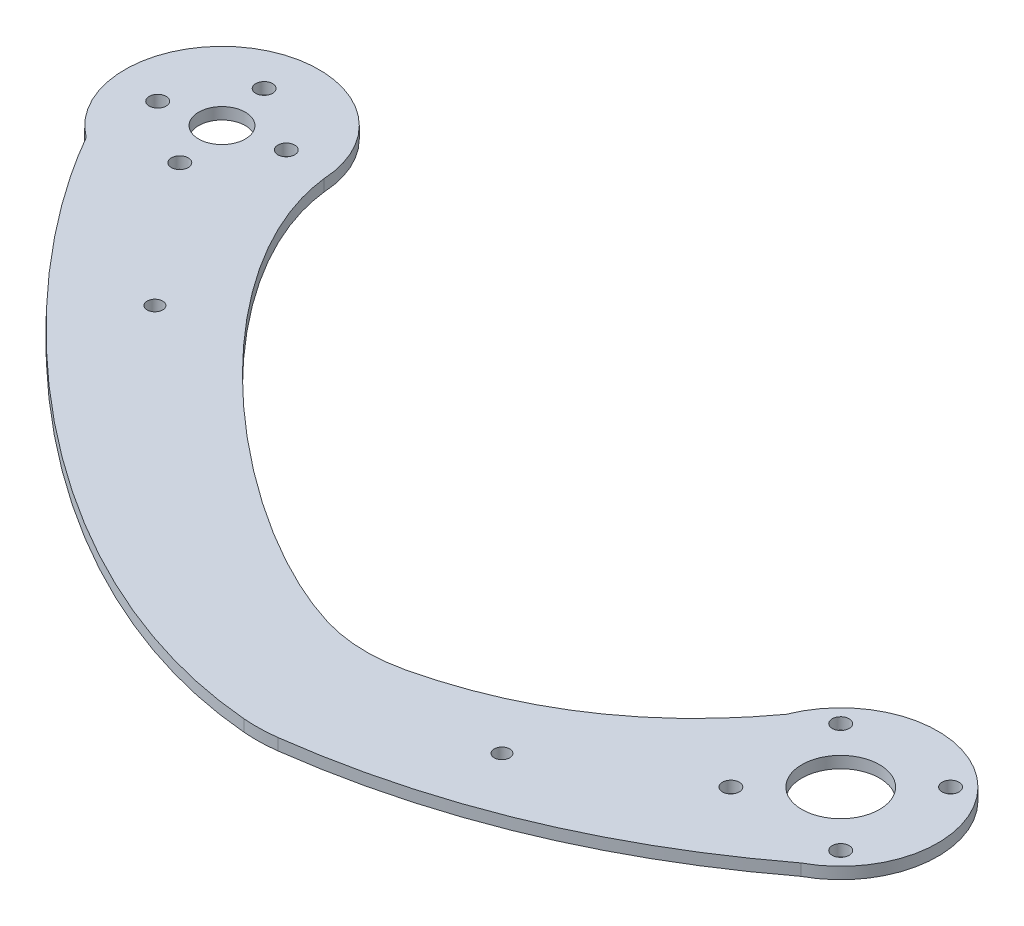
ISO-10303-21;
HEADER;
FILE_DESCRIPTION(('STEP AP214'),'2;1');
FILE_NAME('part.step','',(''),(''),'','','');
FILE_SCHEMA(('AUTOMOTIVE_DESIGN { 1 0 10303 214 1 1 1 1 }'));
ENDSEC;
DATA;
#1=APPLICATION_CONTEXT('core data for automotive mechanical design processes');
#2=APPLICATION_PROTOCOL_DEFINITION('international standard','automotive_design',2000,#1);
#3=PRODUCT_CONTEXT('',#1,'mechanical');
#4=PRODUCT('Part','Part','',(#3));
#5=PRODUCT_RELATED_PRODUCT_CATEGORY('part','',(#4));
#6=PRODUCT_DEFINITION_FORMATION('','',#4);
#7=PRODUCT_DEFINITION_CONTEXT('part definition',#1,'design');
#8=PRODUCT_DEFINITION('design','',#6,#7);
#9=PRODUCT_DEFINITION_SHAPE('','',#8);
#10=(LENGTH_UNIT() NAMED_UNIT(*) SI_UNIT(.MILLI.,.METRE.));
#11=(NAMED_UNIT(*) PLANE_ANGLE_UNIT() SI_UNIT($,.RADIAN.));
#12=(NAMED_UNIT(*) SI_UNIT($,.STERADIAN.) SOLID_ANGLE_UNIT());
#13=UNCERTAINTY_MEASURE_WITH_UNIT(LENGTH_MEASURE(1.E-05),#10,'distance_accuracy_value','');
#14=(GEOMETRIC_REPRESENTATION_CONTEXT(3) GLOBAL_UNCERTAINTY_ASSIGNED_CONTEXT((#13)) GLOBAL_UNIT_ASSIGNED_CONTEXT((#10,
#11,#12)) REPRESENTATION_CONTEXT('',''));
#15=CARTESIAN_POINT('',(0.,0.,0.));
#16=DIRECTION('',(0.,0.,1.));
#17=DIRECTION('',(1.,0.,0.));
#18=AXIS2_PLACEMENT_3D('',#15,#16,#17);
#19=CARTESIAN_POINT('',(-43.7150317978709,1.5,30.941916125743));
#20=CARTESIAN_POINT('',(-74.6558875999215,1.5,29.7721762631503));
#21=CARTESIAN_POINT('',(-107.934743733726,1.5,-0.909272839135125));
#22=CARTESIAN_POINT('',(-120.988196927905,1.5,-23.8545655711311));
#23=B_SPLINE_CURVE_WITH_KNOTS('',3,(#19,#20,#21,#22),.UNSPECIFIED.,.F.,.F.,(4,4),(0.,1.),.UNSPECIFIED.);
#24=DIRECTION('',(0.,-1.,0.));
#25=VECTOR('',#24,1.);
#26=SURFACE_OF_LINEAR_EXTRUSION('',#23,#25);
#27=CARTESIAN_POINT('',(-43.7150317978709,0.,30.941916125743));
#28=CARTESIAN_POINT('',(-74.6558875999215,0.,29.7721762631503));
#29=CARTESIAN_POINT('',(-107.934743733726,0.,-0.909272839135125));
#30=CARTESIAN_POINT('',(-120.988196927905,0.,-23.8545655711311));
#31=B_SPLINE_CURVE_WITH_KNOTS('',3,(#27,#28,#29,#30),.UNSPECIFIED.,.F.,.F.,(4,4),(0.,1.),.UNSPECIFIED.);
#32=CARTESIAN_POINT('',(-46.0345753609874,0.,30.7998596208397));
#33=VERTEX_POINT('',#32);
#34=CARTESIAN_POINT('',(-120.988196927905,0.,-23.8545655711311));
#35=VERTEX_POINT('',#34);
#36=EDGE_CURVE('E185',#33,#35,#31,.T.);
#37=ORIENTED_EDGE('',*,*,#36,.F.);
#38=DIRECTION('',(0.,-1.,0.));
#39=VECTOR('',#38,1.);
#40=CARTESIAN_POINT('',(-46.0345753609874,0.,30.7998596208398));
#41=LINE('',#40,#39);
#42=CARTESIAN_POINT('',(-46.0345753609874,1.5,30.7998596208397));
#43=VERTEX_POINT('',#42);
#44=EDGE_CURVE('E52',#33,#43,#41,.F.);
#45=ORIENTED_EDGE('',*,*,#44,.T.);
#46=CARTESIAN_POINT('',(-120.988196927905,1.5,-23.8545655711311));
#47=VERTEX_POINT('',#46);
#48=EDGE_CURVE('E133',#43,#47,#23,.T.);
#49=ORIENTED_EDGE('',*,*,#48,.T.);
#50=DIRECTION('',(0.,-1.,0.));
#51=VECTOR('',#50,1.);
#52=CARTESIAN_POINT('',(-120.988196927905,1.5,-23.8545655711311));
#53=LINE('',#52,#51);
#54=EDGE_CURVE('E290',#47,#35,#53,.T.);
#55=ORIENTED_EDGE('',*,*,#54,.T.);
#56=EDGE_LOOP('',(#37,#45,#49,#55));
#57=FACE_BOUND('',#56,.T.);
#58=ADVANCED_FACE('F43',(#57),#26,.T.);
#59=CARTESIAN_POINT('',(5.89271121734806,1.5,11.0238811000908));
#60=CARTESIAN_POINT('',(-16.2082829222259,1.5,27.8197472460681));
#61=CARTESIAN_POINT('',(-43.7150317978709,1.5,30.941916125743));
#62=B_SPLINE_CURVE_WITH_KNOTS('',2,(#59,#60,#61),.UNSPECIFIED.,.F.,.F.,(3,3),(0.,1.),.UNSPECIFIED.);
#63=DIRECTION('',(0.,-1.,0.));
#64=VECTOR('',#63,1.);
#65=SURFACE_OF_LINEAR_EXTRUSION('',#62,#64);
#66=CARTESIAN_POINT('',(5.89271121734806,1.5,11.0238811000908));
#67=VERTEX_POINT('',#66);
#68=CARTESIAN_POINT('',(-41.726584062277,1.5,30.6974169888949));
#69=VERTEX_POINT('',#68);
#70=EDGE_CURVE('E113',#67,#69,#62,.T.);
#71=ORIENTED_EDGE('',*,*,#70,.T.);
#72=DIRECTION('',(0.,-1.,0.));
#73=VECTOR('',#72,1.);
#74=CARTESIAN_POINT('',(-41.726584062277,1.5,30.6974169888949));
#75=LINE('',#74,#73);
#76=CARTESIAN_POINT('',(-41.726584062277,0.,30.6974169888949));
#77=VERTEX_POINT('',#76);
#78=EDGE_CURVE('E173',#69,#77,#75,.T.);
#79=ORIENTED_EDGE('',*,*,#78,.T.);
#80=CARTESIAN_POINT('',(5.89271121734806,0.,11.0238811000908));
#81=CARTESIAN_POINT('',(-16.2082829222259,0.,27.8197472460681));
#82=CARTESIAN_POINT('',(-43.7150317978709,0.,30.941916125743));
#83=B_SPLINE_CURVE_WITH_KNOTS('',2,(#80,#81,#82),.UNSPECIFIED.,.F.,.F.,(3,3),(0.,1.),.UNSPECIFIED.);
#84=CARTESIAN_POINT('',(5.89271121734806,0.,11.0238811000908));
#85=VERTEX_POINT('',#84);
#86=EDGE_CURVE('E115',#85,#77,#83,.T.);
#87=ORIENTED_EDGE('',*,*,#86,.F.);
#88=DIRECTION('',(0.,-1.,0.));
#89=VECTOR('',#88,1.);
#90=CARTESIAN_POINT('',(5.89271121734806,1.5,11.0238811000908));
#91=LINE('',#90,#89);
#92=EDGE_CURVE('E108',#67,#85,#91,.T.);
#93=ORIENTED_EDGE('',*,*,#92,.F.);
#94=EDGE_LOOP('',(#71,#79,#87,#93));
#95=FACE_BOUND('',#94,.T.);
#96=ADVANCED_FACE('F110',(#95),#65,.T.);
#97=CARTESIAN_POINT('',(0.,1.5,0.));
#98=DIRECTION('',(0.,-1.,0.));
#99=DIRECTION('',(0.,0.,-1.));
#100=AXIS2_PLACEMENT_3D('',#97,#98,#99);
#101=CYLINDRICAL_SURFACE('',#100,12.5);
#102=CARTESIAN_POINT('',(0.,0.,0.));
#103=DIRECTION('',(0.,1.,0.));
#104=DIRECTION('',(0.,0.,1.));
#105=AXIS2_PLACEMENT_3D('',#102,#103,#104);
#106=CIRCLE('',#105,12.5);
#107=CARTESIAN_POINT('',(-11.6175816478134,0.,-4.61321977109145));
#108=VERTEX_POINT('',#107);
#109=EDGE_CURVE('E300',#85,#108,#106,.T.);
#110=ORIENTED_EDGE('',*,*,#109,.T.);
#111=DIRECTION('',(0.,-1.,0.));
#112=VECTOR('',#111,1.);
#113=CARTESIAN_POINT('',(-11.6175816478134,1.5,-4.61321977109145));
#114=LINE('',#113,#112);
#115=CARTESIAN_POINT('',(-11.6175816478134,1.5,-4.61321977109145));
#116=VERTEX_POINT('',#115);
#117=EDGE_CURVE('E120',#116,#108,#114,.T.);
#118=ORIENTED_EDGE('',*,*,#117,.F.);
#119=CARTESIAN_POINT('',(0.,1.5,0.));
#120=DIRECTION('',(0.,1.,0.));
#121=DIRECTION('',(0.,0.,1.));
#122=AXIS2_PLACEMENT_3D('',#119,#120,#121);
#123=CIRCLE('',#122,12.5);
#124=EDGE_CURVE('E124',#67,#116,#123,.T.);
#125=ORIENTED_EDGE('',*,*,#124,.F.);
#126=ORIENTED_EDGE('',*,*,#92,.T.);
#127=EDGE_LOOP('',(#110,#118,#125,#126));
#128=FACE_BOUND('',#127,.T.);
#129=ADVANCED_FACE('F125',(#128),#101,.T.);
#130=CARTESIAN_POINT('',(-44.5148949759072,1.5,15.6481190292885));
#131=CARTESIAN_POINT('',(-23.7549924871948,1.5,12.0499323994041));
#132=CARTESIAN_POINT('',(-11.6175816478134,1.5,-4.61321977109147));
#133=B_SPLINE_CURVE_WITH_KNOTS('',2,(#130,#131,#132),.UNSPECIFIED.,.F.,.F.,(3,3),(0.,1.),.UNSPECIFIED.);
#134=DIRECTION('',(0.,-1.,0.));
#135=VECTOR('',#134,1.);
#136=SURFACE_OF_LINEAR_EXTRUSION('',#133,#135);
#137=CARTESIAN_POINT('',(-44.5148949759072,0.,15.6481190292885));
#138=CARTESIAN_POINT('',(-23.7549924871948,0.,12.0499323994041));
#139=CARTESIAN_POINT('',(-11.6175816478134,0.,-4.61321977109147));
#140=B_SPLINE_CURVE_WITH_KNOTS('',2,(#137,#138,#139),.UNSPECIFIED.,.F.,.F.,(3,3),(0.,1.),.UNSPECIFIED.);
#141=CARTESIAN_POINT('',(-41.0573845146919,0.,14.9442364399678));
#142=VERTEX_POINT('',#141);
#143=EDGE_CURVE('E305',#142,#108,#140,.T.);
#144=ORIENTED_EDGE('',*,*,#143,.F.);
#145=DIRECTION('',(0.,-1.,0.));
#146=VECTOR('',#145,1.);
#147=CARTESIAN_POINT('',(-41.0573845146919,0.,14.9442364399678));
#148=LINE('',#147,#146);
#149=CARTESIAN_POINT('',(-41.0573845146919,1.5,14.9442364399678));
#150=VERTEX_POINT('',#149);
#151=EDGE_CURVE('E170',#142,#150,#148,.F.);
#152=ORIENTED_EDGE('',*,*,#151,.T.);
#153=EDGE_CURVE('E129',#150,#116,#133,.T.);
#154=ORIENTED_EDGE('',*,*,#153,.T.);
#155=ORIENTED_EDGE('',*,*,#117,.T.);
#156=EDGE_LOOP('',(#144,#152,#154,#155));
#157=FACE_BOUND('',#156,.T.);
#158=ADVANCED_FACE('F274',(#157),#136,.T.);
#159=CARTESIAN_POINT('',(-44.5148949759072,1.5,15.6481190292885));
#160=CARTESIAN_POINT('',(-60.4932461919799,1.5,16.6209660956188));
#161=CARTESIAN_POINT('',(-98.7193744847428,1.5,-13.9940161599674));
#162=CARTESIAN_POINT('',(-101.09932332728,1.5,-34.5772843276964));
#163=B_SPLINE_CURVE_WITH_KNOTS('',3,(#159,#160,#161,#162),.UNSPECIFIED.,.F.,.F.,(4,4),(0.,1.),.UNSPECIFIED.);
#164=DIRECTION('',(0.,-1.,0.));
#165=VECTOR('',#164,1.);
#166=SURFACE_OF_LINEAR_EXTRUSION('',#163,#165);
#167=CARTESIAN_POINT('',(-51.4707376675789,1.5,14.6030158370746));
#168=VERTEX_POINT('',#167);
#169=CARTESIAN_POINT('',(-101.09932332728,1.5,-34.5772843276964));
#170=VERTEX_POINT('',#169);
#171=EDGE_CURVE('E276',#168,#170,#163,.T.);
#172=ORIENTED_EDGE('',*,*,#171,.F.);
#173=DIRECTION('',(0.,-1.,0.));
#174=VECTOR('',#173,1.);
#175=CARTESIAN_POINT('',(-51.4707376675789,1.5,14.6030158370746));
#176=LINE('',#175,#174);
#177=CARTESIAN_POINT('',(-51.4707376675789,0.,14.6030158370746));
#178=VERTEX_POINT('',#177);
#179=EDGE_CURVE('E119',#168,#178,#176,.T.);
#180=ORIENTED_EDGE('',*,*,#179,.T.);
#181=CARTESIAN_POINT('',(-44.5148949759072,0.,15.6481190292885));
#182=CARTESIAN_POINT('',(-60.4932461919799,0.,16.6209660956188));
#183=CARTESIAN_POINT('',(-98.7193744847428,0.,-13.9940161599674));
#184=CARTESIAN_POINT('',(-101.09932332728,0.,-34.5772843276964));
#185=B_SPLINE_CURVE_WITH_KNOTS('',3,(#181,#182,#183,#184),.UNSPECIFIED.,.F.,.F.,(4,4),(0.,1.),.UNSPECIFIED.);
#186=CARTESIAN_POINT('',(-101.09932332728,0.,-34.5772843276964));
#187=VERTEX_POINT('',#186);
#188=EDGE_CURVE('E309',#178,#187,#185,.T.);
#189=ORIENTED_EDGE('',*,*,#188,.T.);
#190=DIRECTION('',(0.,-1.,0.));
#191=VECTOR('',#190,1.);
#192=CARTESIAN_POINT('',(-101.09932332728,1.5,-34.5772843276964));
#193=LINE('',#192,#191);
#194=EDGE_CURVE('E323',#170,#187,#193,.T.);
#195=ORIENTED_EDGE('',*,*,#194,.F.);
#196=EDGE_LOOP('',(#172,#180,#189,#195));
#197=FACE_BOUND('',#196,.T.);
#198=ADVANCED_FACE('F264',(#197),#166,.F.);
#199=CARTESIAN_POINT('',(-113.582262858622,1.5,-33.92442855736));
#200=DIRECTION('',(0.,-1.,0.));
#201=DIRECTION('',(0.,0.,-1.));
#202=AXIS2_PLACEMENT_3D('',#199,#200,#201);
#203=CYLINDRICAL_SURFACE('',#202,12.5);
#204=CARTESIAN_POINT('',(-113.582262858622,0.,-33.92442855736));
#205=DIRECTION('',(0.,1.,0.));
#206=DIRECTION('',(0.,0.,1.));
#207=AXIS2_PLACEMENT_3D('',#204,#205,#206);
#208=CIRCLE('',#207,12.5);
#209=EDGE_CURVE('E135',#187,#35,#208,.T.);
#210=ORIENTED_EDGE('',*,*,#209,.T.);
#211=ORIENTED_EDGE('',*,*,#54,.F.);
#212=CARTESIAN_POINT('',(-113.582262858622,1.5,-33.92442855736));
#213=DIRECTION('',(0.,1.,0.));
#214=DIRECTION('',(0.,0.,1.));
#215=AXIS2_PLACEMENT_3D('',#212,#213,#214);
#216=CIRCLE('',#215,12.5);
#217=EDGE_CURVE('E281',#170,#47,#216,.T.);
#218=ORIENTED_EDGE('',*,*,#217,.F.);
#219=ORIENTED_EDGE('',*,*,#194,.T.);
#220=EDGE_LOOP('',(#210,#211,#218,#219));
#221=FACE_BOUND('',#220,.T.);
#222=ADVANCED_FACE('F258',(#221),#203,.T.);
#223=CARTESIAN_POINT('',(0.,1.5,0.));
#224=DIRECTION('',(0.,1.,0.));
#225=DIRECTION('',(0.,0.,1.));
#226=AXIS2_PLACEMENT_3D('',#223,#224,#225);
#227=PLANE('',#226);
#228=CARTESIAN_POINT('',(-25.5617243230472,1.5,18.0513040104756));
#229=DIRECTION('',(0.,1.,0.));
#230=DIRECTION('',(0.,0.,1.));
#231=AXIS2_PLACEMENT_3D('',#228,#229,#230);
#232=CIRCLE('',#231,1.);
#233=CARTESIAN_POINT('',(-25.5617243230472,1.5,19.0513040104756));
#234=VERTEX_POINT('',#233);
#235=EDGE_CURVE('E234',#234,#234,#232,.T.);
#236=ORIENTED_EDGE('',*,*,#235,.F.);
#237=EDGE_LOOP('',(#236));
#238=FACE_BOUND('',#237,.T.);
#239=CARTESIAN_POINT('',(-97.8402350611844,1.5,-9.54296842905933));
#240=DIRECTION('',(0.,1.,0.));
#241=DIRECTION('',(0.,0.,1.));
#242=AXIS2_PLACEMENT_3D('',#239,#240,#241);
#243=CIRCLE('',#242,0.999999999999998);
#244=CARTESIAN_POINT('',(-97.8402350611844,1.5,-8.54296842905933));
#245=VERTEX_POINT('',#244);
#246=EDGE_CURVE('E224',#245,#245,#243,.T.);
#247=ORIENTED_EDGE('',*,*,#246,.F.);
#248=EDGE_LOOP('',(#247));
#249=FACE_BOUND('',#248,.T.);
#250=CARTESIAN_POINT('',(-120.435814162868,1.5,-32.5000569344801));
#251=DIRECTION('',(0.,1.,0.));
#252=DIRECTION('',(0.,0.,1.));
#253=AXIS2_PLACEMENT_3D('',#250,#251,#252);
#254=CIRCLE('',#253,1.08999999999999);
#255=CARTESIAN_POINT('',(-120.435814162868,1.5,-31.4100569344801));
#256=VERTEX_POINT('',#255);
#257=EDGE_CURVE('E221',#256,#256,#254,.T.);
#258=ORIENTED_EDGE('',*,*,#257,.F.);
#259=EDGE_LOOP('',(#258));
#260=FACE_BOUND('',#259,.T.);
#261=CARTESIAN_POINT('',(-112.157891235742,1.5,-27.0708772531138));
#262=DIRECTION('',(0.,1.,0.));
#263=DIRECTION('',(0.,0.,1.));
#264=AXIS2_PLACEMENT_3D('',#261,#262,#263);
#265=CIRCLE('',#264,1.09);
#266=CARTESIAN_POINT('',(-112.157891235742,1.5,-25.9808772531138));
#267=VERTEX_POINT('',#266);
#268=EDGE_CURVE('E218',#267,#267,#265,.T.);
#269=ORIENTED_EDGE('',*,*,#268,.F.);
#270=EDGE_LOOP('',(#269));
#271=FACE_BOUND('',#270,.T.);
#272=CARTESIAN_POINT('',(-115.006634481501,1.5,-40.7779798616062));
#273=DIRECTION('',(0.,1.,0.));
#274=DIRECTION('',(0.,0.,1.));
#275=AXIS2_PLACEMENT_3D('',#272,#273,#274);
#276=CIRCLE('',#275,1.09000000000004);
#277=CARTESIAN_POINT('',(-115.006634481501,1.5,-39.6879798616061));
#278=VERTEX_POINT('',#277);
#279=EDGE_CURVE('E214',#278,#278,#276,.T.);
#280=ORIENTED_EDGE('',*,*,#279,.F.);
#281=EDGE_LOOP('',(#280));
#282=FACE_BOUND('',#281,.T.);
#283=CARTESIAN_POINT('',(-106.728711554375,1.5,-35.3488001802398));
#284=DIRECTION('',(0.,1.,0.));
#285=DIRECTION('',(0.,0.,1.));
#286=AXIS2_PLACEMENT_3D('',#283,#284,#285);
#287=CIRCLE('',#286,1.08999999999999);
#288=CARTESIAN_POINT('',(-106.728711554375,1.5,-34.2588001802398));
#289=VERTEX_POINT('',#288);
#290=EDGE_CURVE('E210',#289,#289,#287,.T.);
#291=ORIENTED_EDGE('',*,*,#290,.F.);
#292=EDGE_LOOP('',(#291));
#293=FACE_BOUND('',#292,.T.);
#294=CARTESIAN_POINT('',(-7.07106781186559,1.5,7.07106781186536));
#295=DIRECTION('',(0.,1.,0.));
#296=DIRECTION('',(0.,0.,1.));
#297=AXIS2_PLACEMENT_3D('',#294,#295,#296);
#298=CIRCLE('',#297,1.09);
#299=CARTESIAN_POINT('',(-7.07106781186559,1.5,8.16106781186536));
#300=VERTEX_POINT('',#299);
#301=EDGE_CURVE('E206',#300,#300,#298,.T.);
#302=ORIENTED_EDGE('',*,*,#301,.F.);
#303=EDGE_LOOP('',(#302));
#304=FACE_BOUND('',#303,.T.);
#305=CARTESIAN_POINT('',(7.07106781186539,1.5,7.07106781186556));
#306=DIRECTION('',(0.,1.,0.));
#307=DIRECTION('',(0.,0.,1.));
#308=AXIS2_PLACEMENT_3D('',#305,#306,#307);
#309=CIRCLE('',#308,1.09);
#310=CARTESIAN_POINT('',(7.07106781186539,1.5,8.16106781186556));
#311=VERTEX_POINT('',#310);
#312=EDGE_CURVE('E202',#311,#311,#309,.T.);
#313=ORIENTED_EDGE('',*,*,#312,.F.);
#314=EDGE_LOOP('',(#313));
#315=FACE_BOUND('',#314,.T.);
#316=CARTESIAN_POINT('',(7.07106781186554,1.5,-7.07106781186541));
#317=DIRECTION('',(0.,1.,0.));
#318=DIRECTION('',(0.,0.,1.));
#319=AXIS2_PLACEMENT_3D('',#316,#317,#318);
#320=CIRCLE('',#319,1.09);
#321=CARTESIAN_POINT('',(7.07106781186554,1.5,-5.98106781186541));
#322=VERTEX_POINT('',#321);
#323=EDGE_CURVE('E198',#322,#322,#320,.T.);
#324=ORIENTED_EDGE('',*,*,#323,.F.);
#325=EDGE_LOOP('',(#324));
#326=FACE_BOUND('',#325,.T.);
#327=CARTESIAN_POINT('',(-113.582262858622,1.5,-33.92442855736));
#328=DIRECTION('',(0.,1.,0.));
#329=DIRECTION('',(0.,0.,1.));
#330=AXIS2_PLACEMENT_3D('',#327,#328,#329);
#331=CIRCLE('',#330,3.00000000000001);
#332=CARTESIAN_POINT('',(-113.582262858622,1.5,-30.9244285573599));
#333=VERTEX_POINT('',#332);
#334=EDGE_CURVE('E194',#333,#333,#331,.T.);
#335=ORIENTED_EDGE('',*,*,#334,.F.);
#336=EDGE_LOOP('',(#335));
#337=FACE_BOUND('',#336,.T.);
#338=CARTESIAN_POINT('',(-7.07106781186544,1.5,-7.07106781186551));
#339=DIRECTION('',(0.,1.,0.));
#340=DIRECTION('',(0.,0.,1.));
#341=AXIS2_PLACEMENT_3D('',#338,#339,#340);
#342=CIRCLE('',#341,1.09);
#343=CARTESIAN_POINT('',(-7.07106781186544,1.5,-5.98106781186551));
#344=VERTEX_POINT('',#343);
#345=EDGE_CURVE('E190',#344,#344,#342,.T.);
#346=ORIENTED_EDGE('',*,*,#345,.F.);
#347=EDGE_LOOP('',(#346));
#348=FACE_BOUND('',#347,.T.);
#349=CARTESIAN_POINT('',(0.,1.5,0.));
#350=DIRECTION('',(0.,1.,0.));
#351=DIRECTION('',(0.,0.,1.));
#352=AXIS2_PLACEMENT_3D('',#349,#350,#351);
#353=CIRCLE('',#352,5.);
#354=CARTESIAN_POINT('',(0.,1.5,5.));
#355=VERTEX_POINT('',#354);
#356=EDGE_CURVE('E186',#355,#355,#353,.T.);
#357=ORIENTED_EDGE('',*,*,#356,.F.);
#358=EDGE_LOOP('',(#357));
#359=FACE_BOUND('',#358,.T.);
#360=ORIENTED_EDGE('',*,*,#48,.F.);
#361=CARTESIAN_POINT('',(-44.3532717021132,1.5,10.8706544684345));
#362=DIRECTION('',(0.,1.,0.));
#363=DIRECTION('',(0.,0.,1.));
#364=AXIS2_PLACEMENT_3D('',#361,#362,#363);
#365=CIRCLE('',#364,20.);
#366=EDGE_CURVE('E11',#43,#69,#365,.T.);
#367=ORIENTED_EDGE('',*,*,#366,.T.);
#368=ORIENTED_EDGE('',*,*,#70,.F.);
#369=ORIENTED_EDGE('',*,*,#124,.T.);
#370=ORIENTED_EDGE('',*,*,#153,.F.);
#371=CARTESIAN_POINT('',(-45.6316705884273,1.5,-4.52563533453622));
#372=DIRECTION('',(0.,1.,0.));
#373=DIRECTION('',(0.,0.,1.));
#374=AXIS2_PLACEMENT_3D('',#371,#372,#373);
#375=CIRCLE('',#374,20.);
#376=EDGE_CURVE('E169',#150,#168,#375,.F.);
#377=ORIENTED_EDGE('',*,*,#376,.T.);
#378=ORIENTED_EDGE('',*,*,#171,.T.);
#379=ORIENTED_EDGE('',*,*,#217,.T.);
#380=EDGE_LOOP('',(#360,#367,#368,#369,#370,#377,#378,#379));
#381=FACE_BOUND('',#380,.T.);
#382=ADVANCED_FACE('F131',(#238,#249,#260,#271,#282,#293,#304,#315,#326,#337,#348,#359,#381),
#227,.T.);
#383=CARTESIAN_POINT('',(0.,0.,0.));
#384=DIRECTION('',(0.,1.,0.));
#385=DIRECTION('',(0.,0.,1.));
#386=AXIS2_PLACEMENT_3D('',#383,#384,#385);
#387=PLANE('',#386);
#388=CARTESIAN_POINT('',(-25.5617243230472,0.,18.0513040104756));
#389=DIRECTION('',(0.,1.,0.));
#390=DIRECTION('',(0.,0.,1.));
#391=AXIS2_PLACEMENT_3D('',#388,#389,#390);
#392=CIRCLE('',#391,1.);
#393=CARTESIAN_POINT('',(-25.5617243230472,0.,19.0513040104756));
#394=VERTEX_POINT('',#393);
#395=EDGE_CURVE('E47',#394,#394,#392,.T.);
#396=ORIENTED_EDGE('',*,*,#395,.T.);
#397=EDGE_LOOP('',(#396));
#398=FACE_BOUND('',#397,.T.);
#399=CARTESIAN_POINT('',(-97.8402350611844,0.,-9.54296842905933));
#400=DIRECTION('',(0.,1.,0.));
#401=DIRECTION('',(0.,0.,1.));
#402=AXIS2_PLACEMENT_3D('',#399,#400,#401);
#403=CIRCLE('',#402,0.999999999999998);
#404=CARTESIAN_POINT('',(-97.8402350611844,0.,-8.54296842905933));
#405=VERTEX_POINT('',#404);
#406=EDGE_CURVE('E222',#405,#405,#403,.T.);
#407=ORIENTED_EDGE('',*,*,#406,.T.);
#408=EDGE_LOOP('',(#407));
#409=FACE_BOUND('',#408,.T.);
#410=CARTESIAN_POINT('',(-120.435814162868,0.,-32.5000569344801));
#411=DIRECTION('',(0.,1.,0.));
#412=DIRECTION('',(0.,0.,1.));
#413=AXIS2_PLACEMENT_3D('',#410,#411,#412);
#414=CIRCLE('',#413,1.08999999999999);
#415=CARTESIAN_POINT('',(-120.435814162868,0.,-31.4100569344801));
#416=VERTEX_POINT('',#415);
#417=EDGE_CURVE('E219',#416,#416,#414,.T.);
#418=ORIENTED_EDGE('',*,*,#417,.T.);
#419=EDGE_LOOP('',(#418));
#420=FACE_BOUND('',#419,.T.);
#421=CARTESIAN_POINT('',(-112.157891235742,0.,-27.0708772531138));
#422=DIRECTION('',(0.,1.,0.));
#423=DIRECTION('',(0.,0.,1.));
#424=AXIS2_PLACEMENT_3D('',#421,#422,#423);
#425=CIRCLE('',#424,1.09);
#426=CARTESIAN_POINT('',(-112.157891235742,0.,-25.9808772531138));
#427=VERTEX_POINT('',#426);
#428=EDGE_CURVE('E215',#427,#427,#425,.T.);
#429=ORIENTED_EDGE('',*,*,#428,.T.);
#430=EDGE_LOOP('',(#429));
#431=FACE_BOUND('',#430,.T.);
#432=CARTESIAN_POINT('',(-115.006634481501,0.,-40.7779798616062));
#433=DIRECTION('',(0.,1.,0.));
#434=DIRECTION('',(0.,0.,1.));
#435=AXIS2_PLACEMENT_3D('',#432,#433,#434);
#436=CIRCLE('',#435,1.09000000000004);
#437=CARTESIAN_POINT('',(-115.006634481501,0.,-39.6879798616061));
#438=VERTEX_POINT('',#437);
#439=EDGE_CURVE('E211',#438,#438,#436,.T.);
#440=ORIENTED_EDGE('',*,*,#439,.T.);
#441=EDGE_LOOP('',(#440));
#442=FACE_BOUND('',#441,.T.);
#443=CARTESIAN_POINT('',(-106.728711554375,0.,-35.3488001802398));
#444=DIRECTION('',(0.,1.,0.));
#445=DIRECTION('',(0.,0.,1.));
#446=AXIS2_PLACEMENT_3D('',#443,#444,#445);
#447=CIRCLE('',#446,1.08999999999999);
#448=CARTESIAN_POINT('',(-106.728711554375,0.,-34.2588001802398));
#449=VERTEX_POINT('',#448);
#450=EDGE_CURVE('E207',#449,#449,#447,.T.);
#451=ORIENTED_EDGE('',*,*,#450,.T.);
#452=EDGE_LOOP('',(#451));
#453=FACE_BOUND('',#452,.T.);
#454=CARTESIAN_POINT('',(-7.07106781186559,0.,7.07106781186536));
#455=DIRECTION('',(0.,1.,0.));
#456=DIRECTION('',(0.,0.,1.));
#457=AXIS2_PLACEMENT_3D('',#454,#455,#456);
#458=CIRCLE('',#457,1.09);
#459=CARTESIAN_POINT('',(-7.07106781186559,0.,8.16106781186536));
#460=VERTEX_POINT('',#459);
#461=EDGE_CURVE('E203',#460,#460,#458,.T.);
#462=ORIENTED_EDGE('',*,*,#461,.T.);
#463=EDGE_LOOP('',(#462));
#464=FACE_BOUND('',#463,.T.);
#465=CARTESIAN_POINT('',(7.07106781186539,0.,7.07106781186556));
#466=DIRECTION('',(0.,1.,0.));
#467=DIRECTION('',(0.,0.,1.));
#468=AXIS2_PLACEMENT_3D('',#465,#466,#467);
#469=CIRCLE('',#468,1.09);
#470=CARTESIAN_POINT('',(7.07106781186539,0.,8.16106781186556));
#471=VERTEX_POINT('',#470);
#472=EDGE_CURVE('E199',#471,#471,#469,.T.);
#473=ORIENTED_EDGE('',*,*,#472,.T.);
#474=EDGE_LOOP('',(#473));
#475=FACE_BOUND('',#474,.T.);
#476=CARTESIAN_POINT('',(7.07106781186554,0.,-7.07106781186541));
#477=DIRECTION('',(0.,1.,0.));
#478=DIRECTION('',(0.,0.,1.));
#479=AXIS2_PLACEMENT_3D('',#476,#477,#478);
#480=CIRCLE('',#479,1.09);
#481=CARTESIAN_POINT('',(7.07106781186554,0.,-5.98106781186541));
#482=VERTEX_POINT('',#481);
#483=EDGE_CURVE('E195',#482,#482,#480,.T.);
#484=ORIENTED_EDGE('',*,*,#483,.T.);
#485=EDGE_LOOP('',(#484));
#486=FACE_BOUND('',#485,.T.);
#487=CARTESIAN_POINT('',(-113.582262858622,0.,-33.92442855736));
#488=DIRECTION('',(0.,1.,0.));
#489=DIRECTION('',(0.,0.,1.));
#490=AXIS2_PLACEMENT_3D('',#487,#488,#489);
#491=CIRCLE('',#490,3.00000000000001);
#492=CARTESIAN_POINT('',(-113.582262858622,0.,-30.9244285573599));
#493=VERTEX_POINT('',#492);
#494=EDGE_CURVE('E191',#493,#493,#491,.T.);
#495=ORIENTED_EDGE('',*,*,#494,.T.);
#496=EDGE_LOOP('',(#495));
#497=FACE_BOUND('',#496,.T.);
#498=CARTESIAN_POINT('',(-7.07106781186544,0.,-7.07106781186551));
#499=DIRECTION('',(0.,1.,0.));
#500=DIRECTION('',(0.,0.,1.));
#501=AXIS2_PLACEMENT_3D('',#498,#499,#500);
#502=CIRCLE('',#501,1.09);
#503=CARTESIAN_POINT('',(-7.07106781186544,0.,-5.98106781186551));
#504=VERTEX_POINT('',#503);
#505=EDGE_CURVE('E187',#504,#504,#502,.T.);
#506=ORIENTED_EDGE('',*,*,#505,.T.);
#507=EDGE_LOOP('',(#506));
#508=FACE_BOUND('',#507,.T.);
#509=CARTESIAN_POINT('',(0.,0.,0.));
#510=DIRECTION('',(0.,1.,0.));
#511=DIRECTION('',(0.,0.,1.));
#512=AXIS2_PLACEMENT_3D('',#509,#510,#511);
#513=CIRCLE('',#512,5.);
#514=CARTESIAN_POINT('',(0.,0.,5.));
#515=VERTEX_POINT('',#514);
#516=EDGE_CURVE('E182',#515,#515,#513,.T.);
#517=ORIENTED_EDGE('',*,*,#516,.T.);
#518=EDGE_LOOP('',(#517));
#519=FACE_BOUND('',#518,.T.);
#520=ORIENTED_EDGE('',*,*,#86,.T.);
#521=CARTESIAN_POINT('',(-44.3532717021132,0.,10.8706544684345));
#522=DIRECTION('',(0.,1.,0.));
#523=DIRECTION('',(0.,0.,1.));
#524=AXIS2_PLACEMENT_3D('',#521,#522,#523);
#525=CIRCLE('',#524,20.);
#526=EDGE_CURVE('E67',#77,#33,#525,.F.);
#527=ORIENTED_EDGE('',*,*,#526,.T.);
#528=ORIENTED_EDGE('',*,*,#36,.T.);
#529=ORIENTED_EDGE('',*,*,#209,.F.);
#530=ORIENTED_EDGE('',*,*,#188,.F.);
#531=CARTESIAN_POINT('',(-45.6316705884273,0.,-4.52563533453622));
#532=DIRECTION('',(0.,1.,0.));
#533=DIRECTION('',(0.,0.,1.));
#534=AXIS2_PLACEMENT_3D('',#531,#532,#533);
#535=CIRCLE('',#534,20.);
#536=EDGE_CURVE('E174',#178,#142,#535,.T.);
#537=ORIENTED_EDGE('',*,*,#536,.T.);
#538=ORIENTED_EDGE('',*,*,#143,.T.);
#539=ORIENTED_EDGE('',*,*,#109,.F.);
#540=EDGE_LOOP('',(#520,#527,#528,#529,#530,#537,#538,#539));
#541=FACE_BOUND('',#540,.T.);
#542=ADVANCED_FACE('F156',(#398,#409,#420,#431,#442,#453,#464,#475,#486,#497,#508,#519,#541),
#387,.F.);
#543=CARTESIAN_POINT('',(-45.6316705884273,0.75,-4.52563533453622));
#544=DIRECTION('',(0.,-1.,0.));
#545=DIRECTION('',(0.,0.,-1.));
#546=AXIS2_PLACEMENT_3D('',#543,#544,#545);
#547=CYLINDRICAL_SURFACE('',#546,20.);
#548=ORIENTED_EDGE('',*,*,#376,.F.);
#549=ORIENTED_EDGE('',*,*,#151,.F.);
#550=ORIENTED_EDGE('',*,*,#536,.F.);
#551=ORIENTED_EDGE('',*,*,#179,.F.);
#552=EDGE_LOOP('',(#548,#549,#550,#551));
#553=FACE_BOUND('',#552,.T.);
#554=ADVANCED_FACE('F154',(#553),#547,.F.);
#555=CARTESIAN_POINT('',(-44.3532717021132,0.75,10.8706544684345));
#556=DIRECTION('',(0.,-1.,0.));
#557=DIRECTION('',(0.,0.,-1.));
#558=AXIS2_PLACEMENT_3D('',#555,#556,#557);
#559=CYLINDRICAL_SURFACE('',#558,20.);
#560=ORIENTED_EDGE('',*,*,#366,.F.);
#561=ORIENTED_EDGE('',*,*,#44,.F.);
#562=ORIENTED_EDGE('',*,*,#526,.F.);
#563=ORIENTED_EDGE('',*,*,#78,.F.);
#564=EDGE_LOOP('',(#560,#561,#562,#563));
#565=FACE_BOUND('',#564,.T.);
#566=ADVANCED_FACE('F45',(#565),#559,.T.);
#567=CARTESIAN_POINT('',(0.,-8.5,0.));
#568=DIRECTION('',(0.,1.,0.));
#569=DIRECTION('',(0.,0.,1.));
#570=AXIS2_PLACEMENT_3D('',#567,#568,#569);
#571=CYLINDRICAL_SURFACE('',#570,5.);
#572=ORIENTED_EDGE('',*,*,#356,.T.);
#573=EDGE_LOOP('',(#572));
#574=FACE_BOUND('',#573,.T.);
#575=ORIENTED_EDGE('',*,*,#516,.F.);
#576=EDGE_LOOP('',(#575));
#577=FACE_BOUND('',#576,.T.);
#578=ADVANCED_FACE('F162',(#574,#577),#571,.F.);
#579=CARTESIAN_POINT('',(-7.07106781186544,-8.5,-7.07106781186551));
#580=DIRECTION('',(0.,1.,0.));
#581=DIRECTION('',(0.,0.,1.));
#582=AXIS2_PLACEMENT_3D('',#579,#580,#581);
#583=CYLINDRICAL_SURFACE('',#582,1.09);
#584=ORIENTED_EDGE('',*,*,#345,.T.);
#585=EDGE_LOOP('',(#584));
#586=FACE_BOUND('',#585,.T.);
#587=ORIENTED_EDGE('',*,*,#505,.F.);
#588=EDGE_LOOP('',(#587));
#589=FACE_BOUND('',#588,.T.);
#590=ADVANCED_FACE('F483',(#586,#589),#583,.F.);
#591=CARTESIAN_POINT('',(-113.582262858622,-8.5,-33.92442855736));
#592=DIRECTION('',(0.,1.,0.));
#593=DIRECTION('',(0.,0.,1.));
#594=AXIS2_PLACEMENT_3D('',#591,#592,#593);
#595=CYLINDRICAL_SURFACE('',#594,3.00000000000001);
#596=ORIENTED_EDGE('',*,*,#334,.T.);
#597=EDGE_LOOP('',(#596));
#598=FACE_BOUND('',#597,.T.);
#599=ORIENTED_EDGE('',*,*,#494,.F.);
#600=EDGE_LOOP('',(#599));
#601=FACE_BOUND('',#600,.T.);
#602=ADVANCED_FACE('F473',(#598,#601),#595,.F.);
#603=CARTESIAN_POINT('',(7.07106781186554,-8.5,-7.07106781186541));
#604=DIRECTION('',(0.,1.,0.));
#605=DIRECTION('',(0.,0.,1.));
#606=AXIS2_PLACEMENT_3D('',#603,#604,#605);
#607=CYLINDRICAL_SURFACE('',#606,1.09);
#608=ORIENTED_EDGE('',*,*,#323,.T.);
#609=EDGE_LOOP('',(#608));
#610=FACE_BOUND('',#609,.T.);
#611=ORIENTED_EDGE('',*,*,#483,.F.);
#612=EDGE_LOOP('',(#611));
#613=FACE_BOUND('',#612,.T.);
#614=ADVANCED_FACE('F463',(#610,#613),#607,.F.);
#615=CARTESIAN_POINT('',(7.07106781186539,-8.5,7.07106781186556));
#616=DIRECTION('',(0.,1.,0.));
#617=DIRECTION('',(0.,0.,1.));
#618=AXIS2_PLACEMENT_3D('',#615,#616,#617);
#619=CYLINDRICAL_SURFACE('',#618,1.09);
#620=ORIENTED_EDGE('',*,*,#312,.T.);
#621=EDGE_LOOP('',(#620));
#622=FACE_BOUND('',#621,.T.);
#623=ORIENTED_EDGE('',*,*,#472,.F.);
#624=EDGE_LOOP('',(#623));
#625=FACE_BOUND('',#624,.T.);
#626=ADVANCED_FACE('F453',(#622,#625),#619,.F.);
#627=CARTESIAN_POINT('',(-7.07106781186559,-8.5,7.07106781186536));
#628=DIRECTION('',(0.,1.,0.));
#629=DIRECTION('',(0.,0.,1.));
#630=AXIS2_PLACEMENT_3D('',#627,#628,#629);
#631=CYLINDRICAL_SURFACE('',#630,1.09);
#632=ORIENTED_EDGE('',*,*,#301,.T.);
#633=EDGE_LOOP('',(#632));
#634=FACE_BOUND('',#633,.T.);
#635=ORIENTED_EDGE('',*,*,#461,.F.);
#636=EDGE_LOOP('',(#635));
#637=FACE_BOUND('',#636,.T.);
#638=ADVANCED_FACE('F443',(#634,#637),#631,.F.);
#639=CARTESIAN_POINT('',(-106.728711554375,-8.5,-35.3488001802398));
#640=DIRECTION('',(0.,1.,0.));
#641=DIRECTION('',(0.,0.,1.));
#642=AXIS2_PLACEMENT_3D('',#639,#640,#641);
#643=CYLINDRICAL_SURFACE('',#642,1.08999999999999);
#644=ORIENTED_EDGE('',*,*,#290,.T.);
#645=EDGE_LOOP('',(#644));
#646=FACE_BOUND('',#645,.T.);
#647=ORIENTED_EDGE('',*,*,#450,.F.);
#648=EDGE_LOOP('',(#647));
#649=FACE_BOUND('',#648,.T.);
#650=ADVANCED_FACE('F433',(#646,#649),#643,.F.);
#651=CARTESIAN_POINT('',(-115.006634481501,-8.5,-40.7779798616062));
#652=DIRECTION('',(0.,1.,0.));
#653=DIRECTION('',(0.,0.,1.));
#654=AXIS2_PLACEMENT_3D('',#651,#652,#653);
#655=CYLINDRICAL_SURFACE('',#654,1.09000000000004);
#656=ORIENTED_EDGE('',*,*,#279,.T.);
#657=EDGE_LOOP('',(#656));
#658=FACE_BOUND('',#657,.T.);
#659=ORIENTED_EDGE('',*,*,#439,.F.);
#660=EDGE_LOOP('',(#659));
#661=FACE_BOUND('',#660,.T.);
#662=ADVANCED_FACE('F423',(#658,#661),#655,.F.);
#663=CARTESIAN_POINT('',(-112.157891235742,-8.5,-27.0708772531138));
#664=DIRECTION('',(0.,1.,0.));
#665=DIRECTION('',(0.,0.,1.));
#666=AXIS2_PLACEMENT_3D('',#663,#664,#665);
#667=CYLINDRICAL_SURFACE('',#666,1.09);
#668=ORIENTED_EDGE('',*,*,#268,.T.);
#669=EDGE_LOOP('',(#668));
#670=FACE_BOUND('',#669,.T.);
#671=ORIENTED_EDGE('',*,*,#428,.F.);
#672=EDGE_LOOP('',(#671));
#673=FACE_BOUND('',#672,.T.);
#674=ADVANCED_FACE('F414',(#670,#673),#667,.F.);
#675=CARTESIAN_POINT('',(-120.435814162868,-8.5,-32.5000569344801));
#676=DIRECTION('',(0.,1.,0.));
#677=DIRECTION('',(0.,0.,1.));
#678=AXIS2_PLACEMENT_3D('',#675,#676,#677);
#679=CYLINDRICAL_SURFACE('',#678,1.08999999999999);
#680=ORIENTED_EDGE('',*,*,#257,.T.);
#681=EDGE_LOOP('',(#680));
#682=FACE_BOUND('',#681,.T.);
#683=ORIENTED_EDGE('',*,*,#417,.F.);
#684=EDGE_LOOP('',(#683));
#685=FACE_BOUND('',#684,.T.);
#686=ADVANCED_FACE('F392',(#682,#685),#679,.F.);
#687=CARTESIAN_POINT('',(-97.8402350611844,-8.5,-9.54296842905933));
#688=DIRECTION('',(0.,1.,0.));
#689=DIRECTION('',(0.,0.,1.));
#690=AXIS2_PLACEMENT_3D('',#687,#688,#689);
#691=CYLINDRICAL_SURFACE('',#690,0.999999999999998);
#692=ORIENTED_EDGE('',*,*,#246,.T.);
#693=EDGE_LOOP('',(#692));
#694=FACE_BOUND('',#693,.T.);
#695=ORIENTED_EDGE('',*,*,#406,.F.);
#696=EDGE_LOOP('',(#695));
#697=FACE_BOUND('',#696,.T.);
#698=ADVANCED_FACE('F386',(#694,#697),#691,.F.);
#699=CARTESIAN_POINT('',(-25.5617243230472,-8.5,18.0513040104756));
#700=DIRECTION('',(0.,1.,0.));
#701=DIRECTION('',(0.,0.,1.));
#702=AXIS2_PLACEMENT_3D('',#699,#700,#701);
#703=CYLINDRICAL_SURFACE('',#702,1.);
#704=ORIENTED_EDGE('',*,*,#235,.T.);
#705=EDGE_LOOP('',(#704));
#706=FACE_BOUND('',#705,.T.);
#707=ORIENTED_EDGE('',*,*,#395,.F.);
#708=EDGE_LOOP('',(#707));
#709=FACE_BOUND('',#708,.T.);
#710=ADVANCED_FACE('F391',(#706,#709),#703,.F.);
#711=CLOSED_SHELL('',(#58,#96,#129,#158,#198,#222,#382,#542,#554,#566,#578,#590,#602,#614,#626,
#638,#650,#662,#674,#686,#698,#710));
#712=MANIFOLD_SOLID_BREP('B2',#711);
#713=ADVANCED_BREP_SHAPE_REPRESENTATION('',(#18,#712),#14);
#714=SHAPE_DEFINITION_REPRESENTATION(#9,#713);
ENDSEC;
END-ISO-10303-21;
